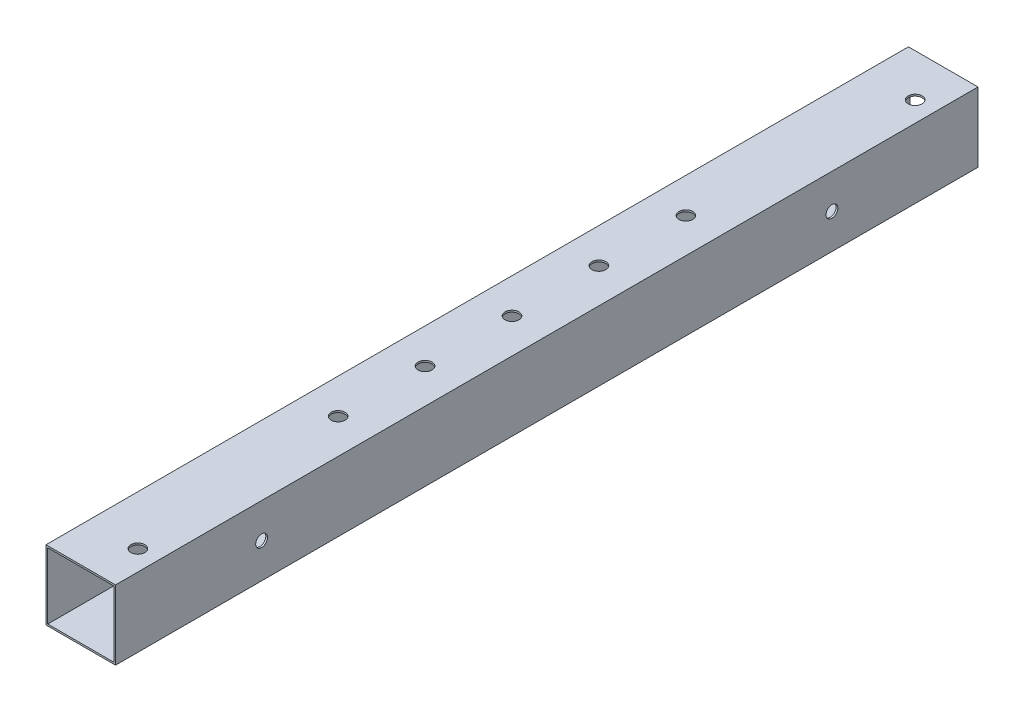
ISO-10303-21;
HEADER;
FILE_DESCRIPTION(('STEP AP214'),'2;1');
FILE_NAME('part.step','',(''),(''),'','','');
FILE_SCHEMA(('AUTOMOTIVE_DESIGN { 1 0 10303 214 1 1 1 1 }'));
ENDSEC;
DATA;
#1=APPLICATION_CONTEXT('core data for automotive mechanical design processes');
#2=APPLICATION_PROTOCOL_DEFINITION('international standard','automotive_design',2000,#1);
#3=PRODUCT_CONTEXT('',#1,'mechanical');
#4=PRODUCT('Part','Part','',(#3));
#5=PRODUCT_RELATED_PRODUCT_CATEGORY('part','',(#4));
#6=PRODUCT_DEFINITION_FORMATION('','',#4);
#7=PRODUCT_DEFINITION_CONTEXT('part definition',#1,'design');
#8=PRODUCT_DEFINITION('design','',#6,#7);
#9=PRODUCT_DEFINITION_SHAPE('','',#8);
#10=(LENGTH_UNIT() NAMED_UNIT(*) SI_UNIT(.MILLI.,.METRE.));
#11=(NAMED_UNIT(*) PLANE_ANGLE_UNIT() SI_UNIT($,.RADIAN.));
#12=(NAMED_UNIT(*) SI_UNIT($,.STERADIAN.) SOLID_ANGLE_UNIT());
#13=UNCERTAINTY_MEASURE_WITH_UNIT(LENGTH_MEASURE(1.E-05),#10,'distance_accuracy_value','');
#14=(GEOMETRIC_REPRESENTATION_CONTEXT(3) GLOBAL_UNCERTAINTY_ASSIGNED_CONTEXT((#13)) GLOBAL_UNIT_ASSIGNED_CONTEXT((#10,
#11,#12)) REPRESENTATION_CONTEXT('',''));
#15=CARTESIAN_POINT('',(0.,0.,0.));
#16=DIRECTION('',(0.,0.,1.));
#17=DIRECTION('',(1.,0.,0.));
#18=AXIS2_PLACEMENT_3D('',#15,#16,#17);
#19=CARTESIAN_POINT('',(10.,10.,-248.));
#20=DIRECTION('',(1.,0.,0.));
#21=DIRECTION('',(0.,0.,-1.));
#22=AXIS2_PLACEMENT_3D('',#19,#20,#21);
#23=PLANE('',#22);
#24=CARTESIAN_POINT('',(10.,0.,-42.));
#25=DIRECTION('',(1.,0.,0.));
#26=DIRECTION('',(0.,0.,-1.));
#27=AXIS2_PLACEMENT_3D('',#24,#25,#26);
#28=CIRCLE('',#27,1.69999999999999);
#29=CARTESIAN_POINT('',(10.,0.,-43.7));
#30=VERTEX_POINT('',#29);
#31=EDGE_CURVE('E204',#30,#30,#28,.T.);
#32=ORIENTED_EDGE('',*,*,#31,.F.);
#33=EDGE_LOOP('',(#32));
#34=FACE_BOUND('',#33,.T.);
#35=CARTESIAN_POINT('',(10.,0.,-206.));
#36=DIRECTION('',(1.,0.,0.));
#37=DIRECTION('',(0.,0.,-1.));
#38=AXIS2_PLACEMENT_3D('',#35,#36,#37);
#39=CIRCLE('',#38,1.70000000000001);
#40=CARTESIAN_POINT('',(10.,0.,-207.7));
#41=VERTEX_POINT('',#40);
#42=EDGE_CURVE('E214',#41,#41,#39,.T.);
#43=ORIENTED_EDGE('',*,*,#42,.F.);
#44=EDGE_LOOP('',(#43));
#45=FACE_BOUND('',#44,.T.);
#46=DIRECTION('',(0.,1.,0.));
#47=VECTOR('',#46,1.);
#48=CARTESIAN_POINT('',(10.,10.,0.));
#49=LINE('',#48,#47);
#50=CARTESIAN_POINT('',(10.,-10.,0.));
#51=VERTEX_POINT('',#50);
#52=CARTESIAN_POINT('',(10.,10.,0.));
#53=VERTEX_POINT('',#52);
#54=EDGE_CURVE('E135',#51,#53,#49,.T.);
#55=ORIENTED_EDGE('',*,*,#54,.F.);
#56=DIRECTION('',(0.,0.,1.));
#57=VECTOR('',#56,1.);
#58=CARTESIAN_POINT('',(10.,-10.,-248.));
#59=LINE('',#58,#57);
#60=CARTESIAN_POINT('',(10.,-10.,-248.));
#61=VERTEX_POINT('',#60);
#62=EDGE_CURVE('E11',#61,#51,#59,.T.);
#63=ORIENTED_EDGE('',*,*,#62,.F.);
#64=DIRECTION('',(0.,1.,0.));
#65=VECTOR('',#64,1.);
#66=CARTESIAN_POINT('',(10.,10.,-248.));
#67=LINE('',#66,#65);
#68=CARTESIAN_POINT('',(10.,10.,-248.));
#69=VERTEX_POINT('',#68);
#70=EDGE_CURVE('E139',#61,#69,#67,.T.);
#71=ORIENTED_EDGE('',*,*,#70,.T.);
#72=DIRECTION('',(0.,0.,1.));
#73=VECTOR('',#72,1.);
#74=CARTESIAN_POINT('',(10.,10.,-248.));
#75=LINE('',#74,#73);
#76=EDGE_CURVE('E152',#69,#53,#75,.T.);
#77=ORIENTED_EDGE('',*,*,#76,.T.);
#78=EDGE_LOOP('',(#55,#63,#71,#77));
#79=FACE_BOUND('',#78,.T.);
#80=ADVANCED_FACE('F34',(#34,#45,#79),#23,.T.);
#81=CARTESIAN_POINT('',(-10.,-10.,-248.));
#82=DIRECTION('',(0.,-1.,0.));
#83=DIRECTION('',(0.,0.,-1.));
#84=AXIS2_PLACEMENT_3D('',#81,#82,#83);
#85=PLANE('',#84);
#86=CARTESIAN_POINT('',(0.,-10.,-74.));
#87=DIRECTION('',(0.,1.,0.));
#88=DIRECTION('',(0.,0.,1.));
#89=AXIS2_PLACEMENT_3D('',#86,#87,#88);
#90=CIRCLE('',#89,2.);
#91=CARTESIAN_POINT('',(0.,-10.,-72.));
#92=VERTEX_POINT('',#91);
#93=EDGE_CURVE('E179',#92,#92,#90,.T.);
#94=ORIENTED_EDGE('',*,*,#93,.T.);
#95=EDGE_LOOP('',(#94));
#96=FACE_BOUND('',#95,.T.);
#97=CARTESIAN_POINT('',(0.,-10.,-99.));
#98=DIRECTION('',(0.,1.,0.));
#99=DIRECTION('',(0.,0.,1.));
#100=AXIS2_PLACEMENT_3D('',#97,#98,#99);
#101=CIRCLE('',#100,2.);
#102=CARTESIAN_POINT('',(0.,-10.,-97.));
#103=VERTEX_POINT('',#102);
#104=EDGE_CURVE('E226',#103,#103,#101,.T.);
#105=ORIENTED_EDGE('',*,*,#104,.T.);
#106=EDGE_LOOP('',(#105));
#107=FACE_BOUND('',#106,.T.);
#108=CARTESIAN_POINT('',(0.,-10.,-124.));
#109=DIRECTION('',(0.,1.,0.));
#110=DIRECTION('',(0.,0.,1.));
#111=AXIS2_PLACEMENT_3D('',#108,#109,#110);
#112=CIRCLE('',#111,2.);
#113=CARTESIAN_POINT('',(0.,-10.,-122.));
#114=VERTEX_POINT('',#113);
#115=EDGE_CURVE('E232',#114,#114,#112,.T.);
#116=ORIENTED_EDGE('',*,*,#115,.T.);
#117=EDGE_LOOP('',(#116));
#118=FACE_BOUND('',#117,.T.);
#119=CARTESIAN_POINT('',(0.,-10.,-149.));
#120=DIRECTION('',(0.,1.,0.));
#121=DIRECTION('',(0.,0.,1.));
#122=AXIS2_PLACEMENT_3D('',#119,#120,#121);
#123=CIRCLE('',#122,2.);
#124=CARTESIAN_POINT('',(0.,-10.,-147.));
#125=VERTEX_POINT('',#124);
#126=EDGE_CURVE('E238',#125,#125,#123,.T.);
#127=ORIENTED_EDGE('',*,*,#126,.T.);
#128=EDGE_LOOP('',(#127));
#129=FACE_BOUND('',#128,.T.);
#130=CARTESIAN_POINT('',(0.,-10.,-174.));
#131=DIRECTION('',(0.,1.,0.));
#132=DIRECTION('',(0.,0.,1.));
#133=AXIS2_PLACEMENT_3D('',#130,#131,#132);
#134=CIRCLE('',#133,2.);
#135=CARTESIAN_POINT('',(0.,-10.,-172.));
#136=VERTEX_POINT('',#135);
#137=EDGE_CURVE('E244',#136,#136,#134,.T.);
#138=ORIENTED_EDGE('',*,*,#137,.T.);
#139=EDGE_LOOP('',(#138));
#140=FACE_BOUND('',#139,.T.);
#141=CARTESIAN_POINT('',(4.1714077163601,-10.,-12.25));
#142=DIRECTION('',(0.,1.,0.));
#143=DIRECTION('',(0.,0.,1.));
#144=AXIS2_PLACEMENT_3D('',#141,#142,#143);
#145=CIRCLE('',#144,2.);
#146=CARTESIAN_POINT('',(4.1714077163601,-10.,-10.25));
#147=VERTEX_POINT('',#146);
#148=EDGE_CURVE('E171',#147,#147,#145,.T.);
#149=ORIENTED_EDGE('',*,*,#148,.T.);
#150=EDGE_LOOP('',(#149));
#151=FACE_BOUND('',#150,.T.);
#152=CARTESIAN_POINT('',(4.1714077163601,-10.,-235.75));
#153=DIRECTION('',(0.,1.,0.));
#154=DIRECTION('',(0.,0.,-1.));
#155=AXIS2_PLACEMENT_3D('',#152,#153,#154);
#156=CIRCLE('',#155,2.00000000000001);
#157=CARTESIAN_POINT('',(4.1714077163601,-10.,-237.75));
#158=VERTEX_POINT('',#157);
#159=EDGE_CURVE('E265',#158,#158,#156,.T.);
#160=ORIENTED_EDGE('',*,*,#159,.T.);
#161=EDGE_LOOP('',(#160));
#162=FACE_BOUND('',#161,.T.);
#163=DIRECTION('',(1.,0.,0.));
#164=VECTOR('',#163,1.);
#165=CARTESIAN_POINT('',(-10.,-10.,0.));
#166=LINE('',#165,#164);
#167=CARTESIAN_POINT('',(-10.,-10.,0.));
#168=VERTEX_POINT('',#167);
#169=EDGE_CURVE('E143',#168,#51,#166,.T.);
#170=ORIENTED_EDGE('',*,*,#169,.F.);
#171=DIRECTION('',(0.,0.,1.));
#172=VECTOR('',#171,1.);
#173=CARTESIAN_POINT('',(-10.,-10.,-248.));
#174=LINE('',#173,#172);
#175=CARTESIAN_POINT('',(-10.,-10.,-248.));
#176=VERTEX_POINT('',#175);
#177=EDGE_CURVE('E42',#176,#168,#174,.T.);
#178=ORIENTED_EDGE('',*,*,#177,.F.);
#179=DIRECTION('',(1.,0.,0.));
#180=VECTOR('',#179,1.);
#181=CARTESIAN_POINT('',(-10.,-10.,-248.));
#182=LINE('',#181,#180);
#183=EDGE_CURVE('E149',#176,#61,#182,.T.);
#184=ORIENTED_EDGE('',*,*,#183,.T.);
#185=ORIENTED_EDGE('',*,*,#62,.T.);
#186=EDGE_LOOP('',(#170,#178,#184,#185));
#187=FACE_BOUND('',#186,.T.);
#188=ADVANCED_FACE('F294',(#96,#107,#118,#129,#140,#151,#162,#187),#85,.T.);
#189=CARTESIAN_POINT('',(-10.,10.,-248.));
#190=DIRECTION('',(-1.,0.,0.));
#191=DIRECTION('',(0.,-1.,0.));
#192=AXIS2_PLACEMENT_3D('',#189,#190,#191);
#193=PLANE('',#192);
#194=CARTESIAN_POINT('',(-10.,0.,-42.));
#195=DIRECTION('',(1.,0.,0.));
#196=DIRECTION('',(0.,0.,-1.));
#197=AXIS2_PLACEMENT_3D('',#194,#195,#196);
#198=CIRCLE('',#197,1.69999999999999);
#199=CARTESIAN_POINT('',(-10.,0.,-43.7));
#200=VERTEX_POINT('',#199);
#201=EDGE_CURVE('E198',#200,#200,#198,.T.);
#202=ORIENTED_EDGE('',*,*,#201,.T.);
#203=EDGE_LOOP('',(#202));
#204=FACE_BOUND('',#203,.T.);
#205=CARTESIAN_POINT('',(-10.,0.,-206.));
#206=DIRECTION('',(1.,0.,0.));
#207=DIRECTION('',(0.,0.,-1.));
#208=AXIS2_PLACEMENT_3D('',#205,#206,#207);
#209=CIRCLE('',#208,1.70000000000001);
#210=CARTESIAN_POINT('',(-10.,0.,-207.7));
#211=VERTEX_POINT('',#210);
#212=EDGE_CURVE('E209',#211,#211,#209,.T.);
#213=ORIENTED_EDGE('',*,*,#212,.T.);
#214=EDGE_LOOP('',(#213));
#215=FACE_BOUND('',#214,.T.);
#216=DIRECTION('',(0.,-1.,0.));
#217=VECTOR('',#216,1.);
#218=CARTESIAN_POINT('',(-10.,10.,0.));
#219=LINE('',#218,#217);
#220=CARTESIAN_POINT('',(-10.,10.,0.));
#221=VERTEX_POINT('',#220);
#222=EDGE_CURVE('E158',#221,#168,#219,.T.);
#223=ORIENTED_EDGE('',*,*,#222,.F.);
#224=DIRECTION('',(0.,0.,1.));
#225=VECTOR('',#224,1.);
#226=CARTESIAN_POINT('',(-10.,10.,-248.));
#227=LINE('',#226,#225);
#228=CARTESIAN_POINT('',(-10.,10.,-248.));
#229=VERTEX_POINT('',#228);
#230=EDGE_CURVE('E164',#229,#221,#227,.T.);
#231=ORIENTED_EDGE('',*,*,#230,.F.);
#232=DIRECTION('',(0.,-1.,0.));
#233=VECTOR('',#232,1.);
#234=CARTESIAN_POINT('',(-10.,10.,-248.));
#235=LINE('',#234,#233);
#236=EDGE_CURVE('E146',#229,#176,#235,.T.);
#237=ORIENTED_EDGE('',*,*,#236,.T.);
#238=ORIENTED_EDGE('',*,*,#177,.T.);
#239=EDGE_LOOP('',(#223,#231,#237,#238));
#240=FACE_BOUND('',#239,.T.);
#241=ADVANCED_FACE('F299',(#204,#215,#240),#193,.T.);
#242=CARTESIAN_POINT('',(-10.,10.,-248.));
#243=DIRECTION('',(0.,1.,0.));
#244=DIRECTION('',(0.,0.,1.));
#245=AXIS2_PLACEMENT_3D('',#242,#243,#244);
#246=PLANE('',#245);
#247=CARTESIAN_POINT('',(0.,10.,-74.));
#248=DIRECTION('',(0.,1.,0.));
#249=DIRECTION('',(0.,0.,1.));
#250=AXIS2_PLACEMENT_3D('',#247,#248,#249);
#251=CIRCLE('',#250,2.);
#252=CARTESIAN_POINT('',(0.,10.,-72.));
#253=VERTEX_POINT('',#252);
#254=EDGE_CURVE('E223',#253,#253,#251,.T.);
#255=ORIENTED_EDGE('',*,*,#254,.F.);
#256=EDGE_LOOP('',(#255));
#257=FACE_BOUND('',#256,.T.);
#258=CARTESIAN_POINT('',(0.,10.,-99.));
#259=DIRECTION('',(0.,1.,0.));
#260=DIRECTION('',(0.,0.,1.));
#261=AXIS2_PLACEMENT_3D('',#258,#259,#260);
#262=CIRCLE('',#261,2.);
#263=CARTESIAN_POINT('',(0.,10.,-97.));
#264=VERTEX_POINT('',#263);
#265=EDGE_CURVE('E229',#264,#264,#262,.T.);
#266=ORIENTED_EDGE('',*,*,#265,.F.);
#267=EDGE_LOOP('',(#266));
#268=FACE_BOUND('',#267,.T.);
#269=CARTESIAN_POINT('',(0.,10.,-124.));
#270=DIRECTION('',(0.,1.,0.));
#271=DIRECTION('',(0.,0.,1.));
#272=AXIS2_PLACEMENT_3D('',#269,#270,#271);
#273=CIRCLE('',#272,2.);
#274=CARTESIAN_POINT('',(0.,10.,-122.));
#275=VERTEX_POINT('',#274);
#276=EDGE_CURVE('E235',#275,#275,#273,.T.);
#277=ORIENTED_EDGE('',*,*,#276,.F.);
#278=EDGE_LOOP('',(#277));
#279=FACE_BOUND('',#278,.T.);
#280=CARTESIAN_POINT('',(0.,10.,-149.));
#281=DIRECTION('',(0.,1.,0.));
#282=DIRECTION('',(0.,0.,1.));
#283=AXIS2_PLACEMENT_3D('',#280,#281,#282);
#284=CIRCLE('',#283,2.);
#285=CARTESIAN_POINT('',(0.,10.,-147.));
#286=VERTEX_POINT('',#285);
#287=EDGE_CURVE('E241',#286,#286,#284,.T.);
#288=ORIENTED_EDGE('',*,*,#287,.F.);
#289=EDGE_LOOP('',(#288));
#290=FACE_BOUND('',#289,.T.);
#291=CARTESIAN_POINT('',(0.,10.,-174.));
#292=DIRECTION('',(0.,1.,0.));
#293=DIRECTION('',(0.,0.,1.));
#294=AXIS2_PLACEMENT_3D('',#291,#292,#293);
#295=CIRCLE('',#294,2.);
#296=CARTESIAN_POINT('',(0.,10.,-172.));
#297=VERTEX_POINT('',#296);
#298=EDGE_CURVE('E220',#297,#297,#295,.T.);
#299=ORIENTED_EDGE('',*,*,#298,.F.);
#300=EDGE_LOOP('',(#299));
#301=FACE_BOUND('',#300,.T.);
#302=CARTESIAN_POINT('',(4.1714077163601,10.,-12.25));
#303=DIRECTION('',(0.,1.,0.));
#304=DIRECTION('',(0.,0.,1.));
#305=AXIS2_PLACEMENT_3D('',#302,#303,#304);
#306=CIRCLE('',#305,2.);
#307=CARTESIAN_POINT('',(4.1714077163601,10.,-10.25));
#308=VERTEX_POINT('',#307);
#309=EDGE_CURVE('E262',#308,#308,#306,.T.);
#310=ORIENTED_EDGE('',*,*,#309,.F.);
#311=EDGE_LOOP('',(#310));
#312=FACE_BOUND('',#311,.T.);
#313=CARTESIAN_POINT('',(4.1714077163601,10.,-235.75));
#314=DIRECTION('',(0.,1.,0.));
#315=DIRECTION('',(0.,0.,-1.));
#316=AXIS2_PLACEMENT_3D('',#313,#314,#315);
#317=CIRCLE('',#316,2.00000000000001);
#318=CARTESIAN_POINT('',(4.1714077163601,10.,-237.75));
#319=VERTEX_POINT('',#318);
#320=EDGE_CURVE('E259',#319,#319,#317,.T.);
#321=ORIENTED_EDGE('',*,*,#320,.F.);
#322=EDGE_LOOP('',(#321));
#323=FACE_BOUND('',#322,.T.);
#324=DIRECTION('',(-1.,0.,0.));
#325=VECTOR('',#324,1.);
#326=CARTESIAN_POINT('',(-10.,10.,0.));
#327=LINE('',#326,#325);
#328=EDGE_CURVE('E155',#53,#221,#327,.T.);
#329=ORIENTED_EDGE('',*,*,#328,.F.);
#330=ORIENTED_EDGE('',*,*,#76,.F.);
#331=DIRECTION('',(-1.,0.,0.));
#332=VECTOR('',#331,1.);
#333=CARTESIAN_POINT('',(-10.,10.,-248.));
#334=LINE('',#333,#332);
#335=EDGE_CURVE('E142',#69,#229,#334,.T.);
#336=ORIENTED_EDGE('',*,*,#335,.T.);
#337=ORIENTED_EDGE('',*,*,#230,.T.);
#338=EDGE_LOOP('',(#329,#330,#336,#337));
#339=FACE_BOUND('',#338,.T.);
#340=ADVANCED_FACE('F318',(#257,#268,#279,#290,#301,#312,#323,#339),#246,.T.);
#341=CARTESIAN_POINT('',(0.,0.,-248.));
#342=DIRECTION('',(0.,0.,1.));
#343=DIRECTION('',(1.,0.,0.));
#344=AXIS2_PLACEMENT_3D('',#341,#342,#343);
#345=PLANE('',#344);
#346=DIRECTION('',(-1.,0.,0.));
#347=VECTOR('',#346,1.);
#348=CARTESIAN_POINT('',(9.5,9.5,-248.));
#349=LINE('',#348,#347);
#350=CARTESIAN_POINT('',(9.5,9.5,-248.));
#351=VERTEX_POINT('',#350);
#352=CARTESIAN_POINT('',(-9.5,9.5,-248.));
#353=VERTEX_POINT('',#352);
#354=EDGE_CURVE('E107',#351,#353,#349,.T.);
#355=ORIENTED_EDGE('',*,*,#354,.T.);
#356=DIRECTION('',(0.,-1.,0.));
#357=VECTOR('',#356,1.);
#358=CARTESIAN_POINT('',(-9.5,-9.5,-248.));
#359=LINE('',#358,#357);
#360=CARTESIAN_POINT('',(-9.5,-9.5,-248.));
#361=VERTEX_POINT('',#360);
#362=EDGE_CURVE('E101',#353,#361,#359,.T.);
#363=ORIENTED_EDGE('',*,*,#362,.T.);
#364=DIRECTION('',(1.,0.,0.));
#365=VECTOR('',#364,1.);
#366=CARTESIAN_POINT('',(9.5,-9.5,-248.));
#367=LINE('',#366,#365);
#368=CARTESIAN_POINT('',(9.5,-9.5,-248.));
#369=VERTEX_POINT('',#368);
#370=EDGE_CURVE('E110',#361,#369,#367,.T.);
#371=ORIENTED_EDGE('',*,*,#370,.T.);
#372=DIRECTION('',(0.,1.,0.));
#373=VECTOR('',#372,1.);
#374=CARTESIAN_POINT('',(9.5,-9.5,-248.));
#375=LINE('',#374,#373);
#376=EDGE_CURVE('E50',#369,#351,#375,.T.);
#377=ORIENTED_EDGE('',*,*,#376,.T.);
#378=EDGE_LOOP('',(#355,#363,#371,#377));
#379=FACE_BOUND('',#378,.T.);
#380=ORIENTED_EDGE('',*,*,#70,.F.);
#381=ORIENTED_EDGE('',*,*,#183,.F.);
#382=ORIENTED_EDGE('',*,*,#236,.F.);
#383=ORIENTED_EDGE('',*,*,#335,.F.);
#384=EDGE_LOOP('',(#380,#381,#382,#383));
#385=FACE_BOUND('',#384,.T.);
#386=ADVANCED_FACE('F114',(#379,#385),#345,.F.);
#387=CARTESIAN_POINT('',(0.,0.,0.));
#388=DIRECTION('',(0.,0.,1.));
#389=DIRECTION('',(1.,0.,0.));
#390=AXIS2_PLACEMENT_3D('',#387,#388,#389);
#391=PLANE('',#390);
#392=DIRECTION('',(0.,-1.,0.));
#393=VECTOR('',#392,1.);
#394=CARTESIAN_POINT('',(-9.5,-9.5,0.));
#395=LINE('',#394,#393);
#396=CARTESIAN_POINT('',(-9.5,9.5,0.));
#397=VERTEX_POINT('',#396);
#398=CARTESIAN_POINT('',(-9.5,-9.5,0.));
#399=VERTEX_POINT('',#398);
#400=EDGE_CURVE('E58',#397,#399,#395,.T.);
#401=ORIENTED_EDGE('',*,*,#400,.F.);
#402=DIRECTION('',(-1.,0.,0.));
#403=VECTOR('',#402,1.);
#404=CARTESIAN_POINT('',(9.5,9.5,0.));
#405=LINE('',#404,#403);
#406=CARTESIAN_POINT('',(9.5,9.5,0.));
#407=VERTEX_POINT('',#406);
#408=EDGE_CURVE('E117',#407,#397,#405,.T.);
#409=ORIENTED_EDGE('',*,*,#408,.F.);
#410=DIRECTION('',(0.,1.,0.));
#411=VECTOR('',#410,1.);
#412=CARTESIAN_POINT('',(9.5,-9.5,0.));
#413=LINE('',#412,#411);
#414=CARTESIAN_POINT('',(9.5,-9.5,0.));
#415=VERTEX_POINT('',#414);
#416=EDGE_CURVE('E120',#415,#407,#413,.T.);
#417=ORIENTED_EDGE('',*,*,#416,.F.);
#418=DIRECTION('',(1.,0.,0.));
#419=VECTOR('',#418,1.);
#420=CARTESIAN_POINT('',(9.5,-9.5,0.));
#421=LINE('',#420,#419);
#422=EDGE_CURVE('E129',#399,#415,#421,.T.);
#423=ORIENTED_EDGE('',*,*,#422,.F.);
#424=EDGE_LOOP('',(#401,#409,#417,#423));
#425=FACE_BOUND('',#424,.T.);
#426=ORIENTED_EDGE('',*,*,#54,.T.);
#427=ORIENTED_EDGE('',*,*,#328,.T.);
#428=ORIENTED_EDGE('',*,*,#222,.T.);
#429=ORIENTED_EDGE('',*,*,#169,.T.);
#430=EDGE_LOOP('',(#426,#427,#428,#429));
#431=FACE_BOUND('',#430,.T.);
#432=ADVANCED_FACE('F311',(#425,#431),#391,.T.);
#433=CARTESIAN_POINT('',(-9.5,-9.5,-248.));
#434=DIRECTION('',(-1.,0.,0.));
#435=DIRECTION('',(0.,0.,1.));
#436=AXIS2_PLACEMENT_3D('',#433,#434,#435);
#437=PLANE('',#436);
#438=CARTESIAN_POINT('',(-9.5,0.,-42.));
#439=DIRECTION('',(-1.,0.,0.));
#440=DIRECTION('',(0.,0.,1.));
#441=AXIS2_PLACEMENT_3D('',#438,#439,#440);
#442=CIRCLE('',#441,1.69999999999999);
#443=CARTESIAN_POINT('',(-9.5,0.,-40.3));
#444=VERTEX_POINT('',#443);
#445=EDGE_CURVE('E217',#444,#444,#442,.T.);
#446=ORIENTED_EDGE('',*,*,#445,.T.);
#447=EDGE_LOOP('',(#446));
#448=FACE_BOUND('',#447,.T.);
#449=CARTESIAN_POINT('',(-9.5,0.,-206.));
#450=DIRECTION('',(-1.,0.,0.));
#451=DIRECTION('',(0.,0.,1.));
#452=AXIS2_PLACEMENT_3D('',#449,#450,#451);
#453=CIRCLE('',#452,1.70000000000001);
#454=CARTESIAN_POINT('',(-9.5,0.,-204.3));
#455=VERTEX_POINT('',#454);
#456=EDGE_CURVE('E197',#455,#455,#453,.T.);
#457=ORIENTED_EDGE('',*,*,#456,.T.);
#458=EDGE_LOOP('',(#457));
#459=FACE_BOUND('',#458,.T.);
#460=ORIENTED_EDGE('',*,*,#400,.T.);
#461=DIRECTION('',(0.,0.,1.));
#462=VECTOR('',#461,1.);
#463=CARTESIAN_POINT('',(-9.5,-9.5,-248.));
#464=LINE('',#463,#462);
#465=EDGE_CURVE('E97',#361,#399,#464,.T.);
#466=ORIENTED_EDGE('',*,*,#465,.F.);
#467=ORIENTED_EDGE('',*,*,#362,.F.);
#468=DIRECTION('',(0.,0.,1.));
#469=VECTOR('',#468,1.);
#470=CARTESIAN_POINT('',(-9.5,9.5,-248.));
#471=LINE('',#470,#469);
#472=EDGE_CURVE('E133',#353,#397,#471,.T.);
#473=ORIENTED_EDGE('',*,*,#472,.T.);
#474=EDGE_LOOP('',(#460,#466,#467,#473));
#475=FACE_BOUND('',#474,.T.);
#476=ADVANCED_FACE('F99',(#448,#459,#475),#437,.F.);
#477=CARTESIAN_POINT('',(9.5,9.5,-248.));
#478=DIRECTION('',(0.,1.,0.));
#479=DIRECTION('',(-1.,0.,0.));
#480=AXIS2_PLACEMENT_3D('',#477,#478,#479);
#481=PLANE('',#480);
#482=CARTESIAN_POINT('',(0.,9.5,-74.));
#483=DIRECTION('',(0.,1.,0.));
#484=DIRECTION('',(-1.,0.,0.));
#485=AXIS2_PLACEMENT_3D('',#482,#483,#484);
#486=CIRCLE('',#485,2.);
#487=CARTESIAN_POINT('',(-2.00000000000003,9.5,-74.));
#488=VERTEX_POINT('',#487);
#489=EDGE_CURVE('E194',#488,#488,#486,.T.);
#490=ORIENTED_EDGE('',*,*,#489,.T.);
#491=EDGE_LOOP('',(#490));
#492=FACE_BOUND('',#491,.T.);
#493=CARTESIAN_POINT('',(0.,9.5,-99.));
#494=DIRECTION('',(0.,1.,0.));
#495=DIRECTION('',(-1.,0.,0.));
#496=AXIS2_PLACEMENT_3D('',#493,#494,#495);
#497=CIRCLE('',#496,2.);
#498=CARTESIAN_POINT('',(-2.00000000000002,9.5,-99.));
#499=VERTEX_POINT('',#498);
#500=EDGE_CURVE('E191',#499,#499,#497,.T.);
#501=ORIENTED_EDGE('',*,*,#500,.T.);
#502=EDGE_LOOP('',(#501));
#503=FACE_BOUND('',#502,.T.);
#504=CARTESIAN_POINT('',(0.,9.5,-124.));
#505=DIRECTION('',(0.,1.,0.));
#506=DIRECTION('',(-1.,0.,0.));
#507=AXIS2_PLACEMENT_3D('',#504,#505,#506);
#508=CIRCLE('',#507,2.);
#509=CARTESIAN_POINT('',(-2.00000000000002,9.5,-124.));
#510=VERTEX_POINT('',#509);
#511=EDGE_CURVE('E187',#510,#510,#508,.T.);
#512=ORIENTED_EDGE('',*,*,#511,.T.);
#513=EDGE_LOOP('',(#512));
#514=FACE_BOUND('',#513,.T.);
#515=CARTESIAN_POINT('',(0.,9.5,-149.));
#516=DIRECTION('',(0.,1.,0.));
#517=DIRECTION('',(-1.,0.,0.));
#518=AXIS2_PLACEMENT_3D('',#515,#516,#517);
#519=CIRCLE('',#518,2.);
#520=CARTESIAN_POINT('',(-2.00000000000002,9.5,-149.));
#521=VERTEX_POINT('',#520);
#522=EDGE_CURVE('E183',#521,#521,#519,.T.);
#523=ORIENTED_EDGE('',*,*,#522,.T.);
#524=EDGE_LOOP('',(#523));
#525=FACE_BOUND('',#524,.T.);
#526=CARTESIAN_POINT('',(0.,9.5,-174.));
#527=DIRECTION('',(0.,1.,0.));
#528=DIRECTION('',(-1.,0.,0.));
#529=AXIS2_PLACEMENT_3D('',#526,#527,#528);
#530=CIRCLE('',#529,2.);
#531=CARTESIAN_POINT('',(-2.,9.5,-174.));
#532=VERTEX_POINT('',#531);
#533=EDGE_CURVE('E178',#532,#532,#530,.T.);
#534=ORIENTED_EDGE('',*,*,#533,.T.);
#535=EDGE_LOOP('',(#534));
#536=FACE_BOUND('',#535,.T.);
#537=CARTESIAN_POINT('',(4.1714077163601,9.5,-12.25));
#538=DIRECTION('',(0.,1.,0.));
#539=DIRECTION('',(-1.,0.,0.));
#540=AXIS2_PLACEMENT_3D('',#537,#538,#539);
#541=CIRCLE('',#540,2.);
#542=CARTESIAN_POINT('',(2.1714077163601,9.5,-12.25));
#543=VERTEX_POINT('',#542);
#544=EDGE_CURVE('E123',#543,#543,#541,.T.);
#545=ORIENTED_EDGE('',*,*,#544,.T.);
#546=EDGE_LOOP('',(#545));
#547=FACE_BOUND('',#546,.T.);
#548=CARTESIAN_POINT('',(4.1714077163601,9.5,-235.75));
#549=DIRECTION('',(0.,1.,0.));
#550=DIRECTION('',(-1.,0.,0.));
#551=AXIS2_PLACEMENT_3D('',#548,#549,#550);
#552=CIRCLE('',#551,2.00000000000001);
#553=CARTESIAN_POINT('',(2.1714077163601,9.5,-235.75));
#554=VERTEX_POINT('',#553);
#555=EDGE_CURVE('E170',#554,#554,#552,.T.);
#556=ORIENTED_EDGE('',*,*,#555,.T.);
#557=EDGE_LOOP('',(#556));
#558=FACE_BOUND('',#557,.T.);
#559=ORIENTED_EDGE('',*,*,#408,.T.);
#560=ORIENTED_EDGE('',*,*,#472,.F.);
#561=ORIENTED_EDGE('',*,*,#354,.F.);
#562=DIRECTION('',(0.,0.,1.));
#563=VECTOR('',#562,1.);
#564=CARTESIAN_POINT('',(9.5,9.5,-248.));
#565=LINE('',#564,#563);
#566=EDGE_CURVE('E136',#351,#407,#565,.T.);
#567=ORIENTED_EDGE('',*,*,#566,.T.);
#568=EDGE_LOOP('',(#559,#560,#561,#567));
#569=FACE_BOUND('',#568,.T.);
#570=ADVANCED_FACE('F272',(#492,#503,#514,#525,#536,#547,#558,#569),#481,.F.);
#571=CARTESIAN_POINT('',(9.5,-9.5,-248.));
#572=DIRECTION('',(1.,0.,0.));
#573=DIRECTION('',(0.,0.,-1.));
#574=AXIS2_PLACEMENT_3D('',#571,#572,#573);
#575=PLANE('',#574);
#576=CARTESIAN_POINT('',(9.5,0.,-42.));
#577=DIRECTION('',(1.,0.,0.));
#578=DIRECTION('',(0.,0.,-1.));
#579=AXIS2_PLACEMENT_3D('',#576,#577,#578);
#580=CIRCLE('',#579,1.69999999999999);
#581=CARTESIAN_POINT('',(9.5,0.,-43.7));
#582=VERTEX_POINT('',#581);
#583=EDGE_CURVE('E37',#582,#582,#580,.T.);
#584=ORIENTED_EDGE('',*,*,#583,.T.);
#585=EDGE_LOOP('',(#584));
#586=FACE_BOUND('',#585,.T.);
#587=CARTESIAN_POINT('',(9.5,0.,-206.));
#588=DIRECTION('',(1.,0.,0.));
#589=DIRECTION('',(0.,0.,-1.));
#590=AXIS2_PLACEMENT_3D('',#587,#588,#589);
#591=CIRCLE('',#590,1.70000000000001);
#592=CARTESIAN_POINT('',(9.5,0.,-207.7));
#593=VERTEX_POINT('',#592);
#594=EDGE_CURVE('E195',#593,#593,#591,.T.);
#595=ORIENTED_EDGE('',*,*,#594,.T.);
#596=EDGE_LOOP('',(#595));
#597=FACE_BOUND('',#596,.T.);
#598=ORIENTED_EDGE('',*,*,#416,.T.);
#599=ORIENTED_EDGE('',*,*,#566,.F.);
#600=ORIENTED_EDGE('',*,*,#376,.F.);
#601=DIRECTION('',(0.,0.,1.));
#602=VECTOR('',#601,1.);
#603=CARTESIAN_POINT('',(9.5,-9.5,-248.));
#604=LINE('',#603,#602);
#605=EDGE_CURVE('E106',#369,#415,#604,.T.);
#606=ORIENTED_EDGE('',*,*,#605,.T.);
#607=EDGE_LOOP('',(#598,#599,#600,#606));
#608=FACE_BOUND('',#607,.T.);
#609=ADVANCED_FACE('F338',(#586,#597,#608),#575,.F.);
#610=CARTESIAN_POINT('',(9.5,-9.5,-248.));
#611=DIRECTION('',(0.,-1.,0.));
#612=DIRECTION('',(1.,0.,0.));
#613=AXIS2_PLACEMENT_3D('',#610,#611,#612);
#614=PLANE('',#613);
#615=CARTESIAN_POINT('',(0.,-9.5,-74.));
#616=DIRECTION('',(0.,-1.,0.));
#617=DIRECTION('',(1.,0.,0.));
#618=AXIS2_PLACEMENT_3D('',#615,#616,#617);
#619=CIRCLE('',#618,2.);
#620=CARTESIAN_POINT('',(1.99999999999997,-9.5,-74.));
#621=VERTEX_POINT('',#620);
#622=EDGE_CURVE('E192',#621,#621,#619,.T.);
#623=ORIENTED_EDGE('',*,*,#622,.T.);
#624=EDGE_LOOP('',(#623));
#625=FACE_BOUND('',#624,.T.);
#626=CARTESIAN_POINT('',(0.,-9.5,-99.));
#627=DIRECTION('',(0.,-1.,0.));
#628=DIRECTION('',(1.,0.,0.));
#629=AXIS2_PLACEMENT_3D('',#626,#627,#628);
#630=CIRCLE('',#629,2.);
#631=CARTESIAN_POINT('',(1.99999999999999,-9.5,-99.));
#632=VERTEX_POINT('',#631);
#633=EDGE_CURVE('E188',#632,#632,#630,.T.);
#634=ORIENTED_EDGE('',*,*,#633,.T.);
#635=EDGE_LOOP('',(#634));
#636=FACE_BOUND('',#635,.T.);
#637=CARTESIAN_POINT('',(0.,-9.5,-124.));
#638=DIRECTION('',(0.,-1.,0.));
#639=DIRECTION('',(1.,0.,0.));
#640=AXIS2_PLACEMENT_3D('',#637,#638,#639);
#641=CIRCLE('',#640,2.);
#642=CARTESIAN_POINT('',(1.99999999999999,-9.5,-124.));
#643=VERTEX_POINT('',#642);
#644=EDGE_CURVE('E184',#643,#643,#641,.T.);
#645=ORIENTED_EDGE('',*,*,#644,.T.);
#646=EDGE_LOOP('',(#645));
#647=FACE_BOUND('',#646,.T.);
#648=CARTESIAN_POINT('',(0.,-9.5,-149.));
#649=DIRECTION('',(0.,-1.,0.));
#650=DIRECTION('',(1.,0.,0.));
#651=AXIS2_PLACEMENT_3D('',#648,#649,#650);
#652=CIRCLE('',#651,2.);
#653=CARTESIAN_POINT('',(1.99999999999999,-9.5,-149.));
#654=VERTEX_POINT('',#653);
#655=EDGE_CURVE('E180',#654,#654,#652,.T.);
#656=ORIENTED_EDGE('',*,*,#655,.T.);
#657=EDGE_LOOP('',(#656));
#658=FACE_BOUND('',#657,.T.);
#659=CARTESIAN_POINT('',(0.,-9.5,-174.));
#660=DIRECTION('',(0.,-1.,0.));
#661=DIRECTION('',(1.,0.,0.));
#662=AXIS2_PLACEMENT_3D('',#659,#660,#661);
#663=CIRCLE('',#662,2.);
#664=CARTESIAN_POINT('',(2.,-9.5,-174.));
#665=VERTEX_POINT('',#664);
#666=EDGE_CURVE('E175',#665,#665,#663,.T.);
#667=ORIENTED_EDGE('',*,*,#666,.T.);
#668=EDGE_LOOP('',(#667));
#669=FACE_BOUND('',#668,.T.);
#670=CARTESIAN_POINT('',(4.1714077163601,-9.5,-12.25));
#671=DIRECTION('',(0.,-1.,0.));
#672=DIRECTION('',(1.,0.,0.));
#673=AXIS2_PLACEMENT_3D('',#670,#671,#672);
#674=CIRCLE('',#673,2.);
#675=CARTESIAN_POINT('',(6.1714077163601,-9.5,-12.25));
#676=VERTEX_POINT('',#675);
#677=EDGE_CURVE('E172',#676,#676,#674,.T.);
#678=ORIENTED_EDGE('',*,*,#677,.T.);
#679=EDGE_LOOP('',(#678));
#680=FACE_BOUND('',#679,.T.);
#681=CARTESIAN_POINT('',(4.1714077163601,-9.5,-235.75));
#682=DIRECTION('',(0.,-1.,0.));
#683=DIRECTION('',(1.,0.,0.));
#684=AXIS2_PLACEMENT_3D('',#681,#682,#683);
#685=CIRCLE('',#684,2.00000000000001);
#686=CARTESIAN_POINT('',(6.17140771636011,-9.5,-235.75));
#687=VERTEX_POINT('',#686);
#688=EDGE_CURVE('E167',#687,#687,#685,.T.);
#689=ORIENTED_EDGE('',*,*,#688,.T.);
#690=EDGE_LOOP('',(#689));
#691=FACE_BOUND('',#690,.T.);
#692=ORIENTED_EDGE('',*,*,#422,.T.);
#693=ORIENTED_EDGE('',*,*,#605,.F.);
#694=ORIENTED_EDGE('',*,*,#370,.F.);
#695=ORIENTED_EDGE('',*,*,#465,.T.);
#696=EDGE_LOOP('',(#692,#693,#694,#695));
#697=FACE_BOUND('',#696,.T.);
#698=ADVANCED_FACE('F111',(#625,#636,#647,#658,#669,#680,#691,#697),#614,.F.);
#699=CARTESIAN_POINT('',(4.1714077163601,-10.,-235.75));
#700=DIRECTION('',(0.,1.,0.));
#701=DIRECTION('',(0.,0.,1.));
#702=AXIS2_PLACEMENT_3D('',#699,#700,#701);
#703=CYLINDRICAL_SURFACE('',#702,2.00000000000001);
#704=ORIENTED_EDGE('',*,*,#159,.F.);
#705=EDGE_LOOP('',(#704));
#706=FACE_BOUND('',#705,.T.);
#707=ORIENTED_EDGE('',*,*,#688,.F.);
#708=EDGE_LOOP('',(#707));
#709=FACE_BOUND('',#708,.T.);
#710=ADVANCED_FACE('F281',(#706,#709),#703,.F.);
#711=CARTESIAN_POINT('',(4.1714077163601,-10.,-12.25));
#712=DIRECTION('',(0.,1.,0.));
#713=DIRECTION('',(0.,0.,1.));
#714=AXIS2_PLACEMENT_3D('',#711,#712,#713);
#715=CYLINDRICAL_SURFACE('',#714,2.);
#716=ORIENTED_EDGE('',*,*,#148,.F.);
#717=EDGE_LOOP('',(#716));
#718=FACE_BOUND('',#717,.T.);
#719=ORIENTED_EDGE('',*,*,#677,.F.);
#720=EDGE_LOOP('',(#719));
#721=FACE_BOUND('',#720,.T.);
#722=ADVANCED_FACE('F278',(#718,#721),#715,.F.);
#723=ORIENTED_EDGE('',*,*,#320,.T.);
#724=EDGE_LOOP('',(#723));
#725=FACE_BOUND('',#724,.T.);
#726=ORIENTED_EDGE('',*,*,#555,.F.);
#727=EDGE_LOOP('',(#726));
#728=FACE_BOUND('',#727,.T.);
#729=ADVANCED_FACE('F275',(#725,#728),#703,.F.);
#730=ORIENTED_EDGE('',*,*,#309,.T.);
#731=EDGE_LOOP('',(#730));
#732=FACE_BOUND('',#731,.T.);
#733=ORIENTED_EDGE('',*,*,#544,.F.);
#734=EDGE_LOOP('',(#733));
#735=FACE_BOUND('',#734,.T.);
#736=ADVANCED_FACE('F277',(#732,#735),#715,.F.);
#737=CARTESIAN_POINT('',(0.,-10.,-174.));
#738=DIRECTION('',(0.,1.,0.));
#739=DIRECTION('',(0.,0.,1.));
#740=AXIS2_PLACEMENT_3D('',#737,#738,#739);
#741=CYLINDRICAL_SURFACE('',#740,2.);
#742=ORIENTED_EDGE('',*,*,#137,.F.);
#743=EDGE_LOOP('',(#742));
#744=FACE_BOUND('',#743,.T.);
#745=ORIENTED_EDGE('',*,*,#666,.F.);
#746=EDGE_LOOP('',(#745));
#747=FACE_BOUND('',#746,.T.);
#748=ADVANCED_FACE('F286',(#744,#747),#741,.F.);
#749=CARTESIAN_POINT('',(0.,-10.,-149.));
#750=DIRECTION('',(0.,1.,0.));
#751=DIRECTION('',(0.,0.,1.));
#752=AXIS2_PLACEMENT_3D('',#749,#750,#751);
#753=CYLINDRICAL_SURFACE('',#752,2.);
#754=ORIENTED_EDGE('',*,*,#126,.F.);
#755=EDGE_LOOP('',(#754));
#756=FACE_BOUND('',#755,.T.);
#757=ORIENTED_EDGE('',*,*,#655,.F.);
#758=EDGE_LOOP('',(#757));
#759=FACE_BOUND('',#758,.T.);
#760=ADVANCED_FACE('F373',(#756,#759),#753,.F.);
#761=CARTESIAN_POINT('',(0.,-10.,-124.));
#762=DIRECTION('',(0.,1.,0.));
#763=DIRECTION('',(0.,0.,1.));
#764=AXIS2_PLACEMENT_3D('',#761,#762,#763);
#765=CYLINDRICAL_SURFACE('',#764,2.);
#766=ORIENTED_EDGE('',*,*,#115,.F.);
#767=EDGE_LOOP('',(#766));
#768=FACE_BOUND('',#767,.T.);
#769=ORIENTED_EDGE('',*,*,#644,.F.);
#770=EDGE_LOOP('',(#769));
#771=FACE_BOUND('',#770,.T.);
#772=ADVANCED_FACE('F383',(#768,#771),#765,.F.);
#773=CARTESIAN_POINT('',(0.,-10.,-99.));
#774=DIRECTION('',(0.,1.,0.));
#775=DIRECTION('',(0.,0.,1.));
#776=AXIS2_PLACEMENT_3D('',#773,#774,#775);
#777=CYLINDRICAL_SURFACE('',#776,2.);
#778=ORIENTED_EDGE('',*,*,#104,.F.);
#779=EDGE_LOOP('',(#778));
#780=FACE_BOUND('',#779,.T.);
#781=ORIENTED_EDGE('',*,*,#633,.F.);
#782=EDGE_LOOP('',(#781));
#783=FACE_BOUND('',#782,.T.);
#784=ADVANCED_FACE('F374',(#780,#783),#777,.F.);
#785=CARTESIAN_POINT('',(0.,-10.,-74.));
#786=DIRECTION('',(0.,1.,0.));
#787=DIRECTION('',(0.,0.,1.));
#788=AXIS2_PLACEMENT_3D('',#785,#786,#787);
#789=CYLINDRICAL_SURFACE('',#788,2.);
#790=ORIENTED_EDGE('',*,*,#93,.F.);
#791=EDGE_LOOP('',(#790));
#792=FACE_BOUND('',#791,.T.);
#793=ORIENTED_EDGE('',*,*,#622,.F.);
#794=EDGE_LOOP('',(#793));
#795=FACE_BOUND('',#794,.T.);
#796=ADVANCED_FACE('F363',(#792,#795),#789,.F.);
#797=ORIENTED_EDGE('',*,*,#298,.T.);
#798=EDGE_LOOP('',(#797));
#799=FACE_BOUND('',#798,.T.);
#800=ORIENTED_EDGE('',*,*,#533,.F.);
#801=EDGE_LOOP('',(#800));
#802=FACE_BOUND('',#801,.T.);
#803=ADVANCED_FACE('F360',(#799,#802),#741,.F.);
#804=ORIENTED_EDGE('',*,*,#287,.T.);
#805=EDGE_LOOP('',(#804));
#806=FACE_BOUND('',#805,.T.);
#807=ORIENTED_EDGE('',*,*,#522,.F.);
#808=EDGE_LOOP('',(#807));
#809=FACE_BOUND('',#808,.T.);
#810=ADVANCED_FACE('F362',(#806,#809),#753,.F.);
#811=ORIENTED_EDGE('',*,*,#276,.T.);
#812=EDGE_LOOP('',(#811));
#813=FACE_BOUND('',#812,.T.);
#814=ORIENTED_EDGE('',*,*,#511,.F.);
#815=EDGE_LOOP('',(#814));
#816=FACE_BOUND('',#815,.T.);
#817=ADVANCED_FACE('F370',(#813,#816),#765,.F.);
#818=ORIENTED_EDGE('',*,*,#265,.T.);
#819=EDGE_LOOP('',(#818));
#820=FACE_BOUND('',#819,.T.);
#821=ORIENTED_EDGE('',*,*,#500,.F.);
#822=EDGE_LOOP('',(#821));
#823=FACE_BOUND('',#822,.T.);
#824=ADVANCED_FACE('F409',(#820,#823),#777,.F.);
#825=ORIENTED_EDGE('',*,*,#254,.T.);
#826=EDGE_LOOP('',(#825));
#827=FACE_BOUND('',#826,.T.);
#828=ORIENTED_EDGE('',*,*,#489,.F.);
#829=EDGE_LOOP('',(#828));
#830=FACE_BOUND('',#829,.T.);
#831=ADVANCED_FACE('F377',(#827,#830),#789,.F.);
#832=CARTESIAN_POINT('',(-10.,0.,-206.));
#833=DIRECTION('',(1.,0.,0.));
#834=DIRECTION('',(0.,0.,-1.));
#835=AXIS2_PLACEMENT_3D('',#832,#833,#834);
#836=CYLINDRICAL_SURFACE('',#835,1.70000000000001);
#837=ORIENTED_EDGE('',*,*,#42,.T.);
#838=EDGE_LOOP('',(#837));
#839=FACE_BOUND('',#838,.T.);
#840=ORIENTED_EDGE('',*,*,#594,.F.);
#841=EDGE_LOOP('',(#840));
#842=FACE_BOUND('',#841,.T.);
#843=ADVANCED_FACE('F415',(#839,#842),#836,.F.);
#844=CARTESIAN_POINT('',(-10.,0.,-42.));
#845=DIRECTION('',(1.,0.,0.));
#846=DIRECTION('',(0.,0.,-1.));
#847=AXIS2_PLACEMENT_3D('',#844,#845,#846);
#848=CYLINDRICAL_SURFACE('',#847,1.69999999999999);
#849=ORIENTED_EDGE('',*,*,#31,.T.);
#850=EDGE_LOOP('',(#849));
#851=FACE_BOUND('',#850,.T.);
#852=ORIENTED_EDGE('',*,*,#583,.F.);
#853=EDGE_LOOP('',(#852));
#854=FACE_BOUND('',#853,.T.);
#855=ADVANCED_FACE('F421',(#851,#854),#848,.F.);
#856=ORIENTED_EDGE('',*,*,#212,.F.);
#857=EDGE_LOOP('',(#856));
#858=FACE_BOUND('',#857,.T.);
#859=ORIENTED_EDGE('',*,*,#456,.F.);
#860=EDGE_LOOP('',(#859));
#861=FACE_BOUND('',#860,.T.);
#862=ADVANCED_FACE('F417',(#858,#861),#836,.F.);
#863=ORIENTED_EDGE('',*,*,#201,.F.);
#864=EDGE_LOOP('',(#863));
#865=FACE_BOUND('',#864,.T.);
#866=ORIENTED_EDGE('',*,*,#445,.F.);
#867=EDGE_LOOP('',(#866));
#868=FACE_BOUND('',#867,.T.);
#869=ADVANCED_FACE('F420',(#865,#868),#848,.F.);
#870=CLOSED_SHELL('',(#80,#188,#241,#340,#386,#432,#476,#570,#609,#698,#710,#722,#729,#736,#748,
#760,#772,#784,#796,#803,#810,#817,#824,#831,#843,#855,#862,#869));
#871=MANIFOLD_SOLID_BREP('B2',#870);
#872=ADVANCED_BREP_SHAPE_REPRESENTATION('',(#18,#871),#14);
#873=SHAPE_DEFINITION_REPRESENTATION(#9,#872);
ENDSEC;
END-ISO-10303-21;
